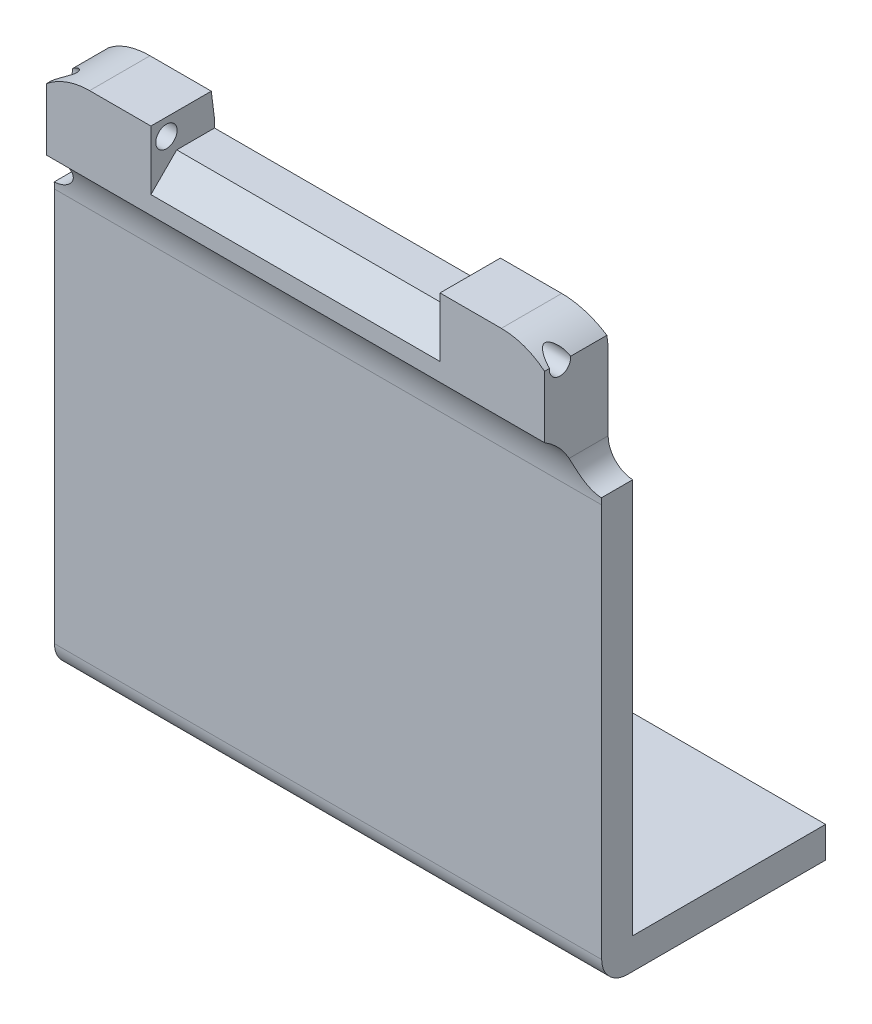
ISO-10303-21;
HEADER;
FILE_DESCRIPTION(('STEP AP214'),'2;1');
FILE_NAME('part.step','',(''),(''),'','','');
FILE_SCHEMA(('AUTOMOTIVE_DESIGN { 1 0 10303 214 1 1 1 1 }'));
ENDSEC;
DATA;
#1=APPLICATION_CONTEXT('core data for automotive mechanical design processes');
#2=APPLICATION_PROTOCOL_DEFINITION('international standard','automotive_design',2000,#1);
#3=PRODUCT_CONTEXT('',#1,'mechanical');
#4=PRODUCT('Part','Part','',(#3));
#5=PRODUCT_RELATED_PRODUCT_CATEGORY('part','',(#4));
#6=PRODUCT_DEFINITION_FORMATION('','',#4);
#7=PRODUCT_DEFINITION_CONTEXT('part definition',#1,'design');
#8=PRODUCT_DEFINITION('design','',#6,#7);
#9=PRODUCT_DEFINITION_SHAPE('','',#8);
#10=(LENGTH_UNIT() NAMED_UNIT(*) SI_UNIT(.MILLI.,.METRE.));
#11=(NAMED_UNIT(*) PLANE_ANGLE_UNIT() SI_UNIT($,.RADIAN.));
#12=(NAMED_UNIT(*) SI_UNIT($,.STERADIAN.) SOLID_ANGLE_UNIT());
#13=UNCERTAINTY_MEASURE_WITH_UNIT(LENGTH_MEASURE(1.E-05),#10,'distance_accuracy_value','');
#14=(GEOMETRIC_REPRESENTATION_CONTEXT(3) GLOBAL_UNCERTAINTY_ASSIGNED_CONTEXT((#13)) GLOBAL_UNIT_ASSIGNED_CONTEXT((#10,
#11,#12)) REPRESENTATION_CONTEXT('',''));
#15=CARTESIAN_POINT('',(0.,0.,0.));
#16=DIRECTION('',(0.,0.,1.));
#17=DIRECTION('',(1.,0.,0.));
#18=AXIS2_PLACEMENT_3D('',#15,#16,#17);
#19=CARTESIAN_POINT('',(0.,40.6,2.4));
#20=DIRECTION('',(0.,-1.,0.));
#21=DIRECTION('',(0.,0.,-1.));
#22=AXIS2_PLACEMENT_3D('',#19,#20,#21);
#23=PLANE('',#22);
#24=DIRECTION('',(1.,0.,0.));
#25=VECTOR('',#24,1.);
#26=CARTESIAN_POINT('',(-6.40000000000006,40.6,0.25));
#27=LINE('',#26,#25);
#28=CARTESIAN_POINT('',(5.24999999999999,40.6,0.25));
#29=VERTEX_POINT('',#28);
#30=CARTESIAN_POINT('',(9.99999999999994,40.6,0.25));
#31=VERTEX_POINT('',#30);
#32=EDGE_CURVE('E404',#29,#31,#27,.T.);
#33=ORIENTED_EDGE('',*,*,#32,.F.);
#34=DIRECTION('',(0.,0.,-1.));
#35=VECTOR('',#34,1.);
#36=CARTESIAN_POINT('',(5.24999999999999,40.6,2.4));
#37=LINE('',#36,#35);
#38=CARTESIAN_POINT('',(5.24999999999999,40.6,4.93));
#39=VERTEX_POINT('',#38);
#40=EDGE_CURVE('E329',#29,#39,#37,.F.);
#41=ORIENTED_EDGE('',*,*,#40,.T.);
#42=DIRECTION('',(-1.,0.,0.));
#43=VECTOR('',#42,1.);
#44=CARTESIAN_POINT('',(0.,40.6,4.93));
#45=LINE('',#44,#43);
#46=CARTESIAN_POINT('',(9.99999999999999,40.6,4.93));
#47=VERTEX_POINT('',#46);
#48=EDGE_CURVE('E238',#47,#39,#45,.T.);
#49=ORIENTED_EDGE('',*,*,#48,.F.);
#50=DIRECTION('',(0.,0.,1.));
#51=VECTOR('',#50,1.);
#52=CARTESIAN_POINT('',(9.99999999999999,40.6,-22.5503880232691));
#53=LINE('',#52,#51);
#54=EDGE_CURVE('E248',#31,#47,#53,.T.);
#55=ORIENTED_EDGE('',*,*,#54,.F.);
#56=EDGE_LOOP('',(#33,#41,#49,#55));
#57=FACE_BOUND('',#56,.T.);
#58=ADVANCED_FACE('F37',(#57),#23,.F.);
#59=CARTESIAN_POINT('',(0.,0.,0.));
#60=DIRECTION('',(0.,0.,-1.));
#61=DIRECTION('',(-1.,0.,0.));
#62=AXIS2_PLACEMENT_3D('',#59,#60,#61);
#63=PLANE('',#62);
#64=DIRECTION('',(0.,-1.,0.));
#65=VECTOR('',#64,1.);
#66=CARTESIAN_POINT('',(1.89999999999999,30.6,0.));
#67=LINE('',#66,#65);
#68=CARTESIAN_POINT('',(1.89999999999999,38.6,0.));
#69=VERTEX_POINT('',#68);
#70=CARTESIAN_POINT('',(1.89999999999999,32.5974984355438,0.));
#71=VERTEX_POINT('',#70);
#72=EDGE_CURVE('E386',#69,#71,#67,.T.);
#73=ORIENTED_EDGE('',*,*,#72,.F.);
#74=DIRECTION('',(1.,0.,0.));
#75=VECTOR('',#74,1.);
#76=CARTESIAN_POINT('',(-6.40000000000005,38.6,0.));
#77=LINE('',#76,#75);
#78=CARTESIAN_POINT('',(9.99999999999995,38.6,0.));
#79=VERTEX_POINT('',#78);
#80=EDGE_CURVE('E405',#69,#79,#77,.T.);
#81=ORIENTED_EDGE('',*,*,#80,.T.);
#82=DIRECTION('',(0.,-1.,0.));
#83=VECTOR('',#82,1.);
#84=CARTESIAN_POINT('',(9.99999999999999,40.6,0.));
#85=LINE('',#84,#83);
#86=CARTESIAN_POINT('',(9.99999999999999,38.,0.));
#87=VERTEX_POINT('',#86);
#88=EDGE_CURVE('E245',#79,#87,#85,.T.);
#89=ORIENTED_EDGE('',*,*,#88,.T.);
#90=DIRECTION('',(1.,0.,0.));
#91=VECTOR('',#90,1.);
#92=CARTESIAN_POINT('',(9.99999999999999,38.,0.));
#93=LINE('',#92,#91);
#94=CARTESIAN_POINT('',(32.4,38.,0.));
#95=VERTEX_POINT('',#94);
#96=EDGE_CURVE('E241',#87,#95,#93,.T.);
#97=ORIENTED_EDGE('',*,*,#96,.T.);
#98=DIRECTION('',(0.,1.,0.));
#99=VECTOR('',#98,1.);
#100=CARTESIAN_POINT('',(32.4,40.6,0.));
#101=LINE('',#100,#99);
#102=CARTESIAN_POINT('',(32.4,38.6,0.));
#103=VERTEX_POINT('',#102);
#104=EDGE_CURVE('E249',#95,#103,#101,.T.);
#105=ORIENTED_EDGE('',*,*,#104,.T.);
#106=DIRECTION('',(-1.,0.,0.));
#107=VECTOR('',#106,1.);
#108=CARTESIAN_POINT('',(48.8,38.6,0.));
#109=LINE('',#108,#107);
#110=CARTESIAN_POINT('',(40.5,38.6,0.));
#111=VERTEX_POINT('',#110);
#112=EDGE_CURVE('E223',#111,#103,#109,.T.);
#113=ORIENTED_EDGE('',*,*,#112,.F.);
#114=DIRECTION('',(0.,1.,0.));
#115=VECTOR('',#114,1.);
#116=CARTESIAN_POINT('',(40.5,30.6,0.));
#117=LINE('',#116,#115);
#118=CARTESIAN_POINT('',(40.5,32.5974984355438,0.));
#119=VERTEX_POINT('',#118);
#120=EDGE_CURVE('E374',#119,#111,#117,.T.);
#121=ORIENTED_EDGE('',*,*,#120,.F.);
#122=CARTESIAN_POINT('',(42.5,32.5974984355438,0.));
#123=DIRECTION('',(0.,0.,-1.));
#124=DIRECTION('',(-1.,0.,0.));
#125=AXIS2_PLACEMENT_3D('',#122,#123,#124);
#126=CIRCLE('',#125,2.);
#127=CARTESIAN_POINT('',(42.4,30.6,0.));
#128=VERTEX_POINT('',#127);
#129=EDGE_CURVE('E459',#119,#128,#126,.F.);
#130=ORIENTED_EDGE('',*,*,#129,.T.);
#131=DIRECTION('',(0.,1.,0.));
#132=VECTOR('',#131,1.);
#133=CARTESIAN_POINT('',(42.4,0.,0.));
#134=LINE('',#133,#132);
#135=CARTESIAN_POINT('',(42.4,0.,0.));
#136=VERTEX_POINT('',#135);
#137=EDGE_CURVE('E285',#136,#128,#134,.T.);
#138=ORIENTED_EDGE('',*,*,#137,.F.);
#139=DIRECTION('',(1.,0.,0.));
#140=VECTOR('',#139,1.);
#141=CARTESIAN_POINT('',(0.,0.,0.));
#142=LINE('',#141,#140);
#143=CARTESIAN_POINT('',(0.,0.,0.));
#144=VERTEX_POINT('',#143);
#145=EDGE_CURVE('E321',#144,#136,#142,.T.);
#146=ORIENTED_EDGE('',*,*,#145,.F.);
#147=DIRECTION('',(0.,-1.,0.));
#148=VECTOR('',#147,1.);
#149=CARTESIAN_POINT('',(0.,0.,0.));
#150=LINE('',#149,#148);
#151=CARTESIAN_POINT('',(0.,30.6,0.));
#152=VERTEX_POINT('',#151);
#153=EDGE_CURVE('E274',#152,#144,#150,.T.);
#154=ORIENTED_EDGE('',*,*,#153,.F.);
#155=CARTESIAN_POINT('',(-0.100000000000008,32.5974984355438,0.));
#156=DIRECTION('',(0.,0.,-1.));
#157=DIRECTION('',(-1.,0.,0.));
#158=AXIS2_PLACEMENT_3D('',#155,#156,#157);
#159=CIRCLE('',#158,2.);
#160=EDGE_CURVE('E533',#152,#71,#159,.F.);
#161=ORIENTED_EDGE('',*,*,#160,.T.);
#162=EDGE_LOOP('',(#73,#81,#89,#97,#105,#113,#121,#130,#138,#146,#154,#161));
#163=FACE_BOUND('',#162,.T.);
#164=ADVANCED_FACE('F353',(#163),#63,.T.);
#165=CARTESIAN_POINT('',(9.99999999999999,40.6,-22.5503880232691));
#166=DIRECTION('',(-1.,0.,0.));
#167=DIRECTION('',(0.,-1.,0.));
#168=AXIS2_PLACEMENT_3D('',#165,#166,#167);
#169=PLANE('',#168);
#170=CARTESIAN_POINT('',(9.99999999999999,39.3,3.73));
#171=DIRECTION('',(-1.,0.,0.));
#172=DIRECTION('',(0.,-1.,0.));
#173=AXIS2_PLACEMENT_3D('',#170,#171,#172);
#174=CIRCLE('',#173,0.8255);
#175=CARTESIAN_POINT('',(9.99999999999999,38.4745,3.73));
#176=VERTEX_POINT('',#175);
#177=EDGE_CURVE('E411',#176,#176,#174,.T.);
#178=ORIENTED_EDGE('',*,*,#177,.T.);
#179=EDGE_LOOP('',(#178));
#180=FACE_BOUND('',#179,.T.);
#181=DIRECTION('',(0.,0.992277876713668,0.124034734589208));
#182=VECTOR('',#181,1.);
#183=CARTESIAN_POINT('',(9.99999999999995,38.6,0.));
#184=LINE('',#183,#182);
#185=EDGE_CURVE('E407',#79,#31,#184,.T.);
#186=ORIENTED_EDGE('',*,*,#185,.T.);
#187=ORIENTED_EDGE('',*,*,#54,.T.);
#188=DIRECTION('',(0.,1.,0.));
#189=VECTOR('',#188,1.);
#190=CARTESIAN_POINT('',(9.99999999999994,0.,4.93));
#191=LINE('',#190,#189);
#192=CARTESIAN_POINT('',(9.99999999999999,36.,4.93));
#193=VERTEX_POINT('',#192);
#194=EDGE_CURVE('E235',#193,#47,#191,.T.);
#195=ORIENTED_EDGE('',*,*,#194,.F.);
#196=DIRECTION('',(0.,0.707106781186548,-0.707106781186547));
#197=VECTOR('',#196,1.);
#198=CARTESIAN_POINT('',(10.,52.0401940116346,-11.1101940116346));
#199=LINE('',#198,#197);
#200=CARTESIAN_POINT('',(9.99999999999999,38.,2.93));
#201=VERTEX_POINT('',#200);
#202=EDGE_CURVE('E309',#193,#201,#199,.T.);
#203=ORIENTED_EDGE('',*,*,#202,.T.);
#204=DIRECTION('',(0.,0.,1.));
#205=VECTOR('',#204,1.);
#206=CARTESIAN_POINT('',(9.99999999999999,38.,-22.5503880232691));
#207=LINE('',#206,#205);
#208=EDGE_CURVE('E247',#87,#201,#207,.T.);
#209=ORIENTED_EDGE('',*,*,#208,.F.);
#210=ORIENTED_EDGE('',*,*,#88,.F.);
#211=EDGE_LOOP('',(#186,#187,#195,#203,#209,#210));
#212=FACE_BOUND('',#211,.T.);
#213=ADVANCED_FACE('F472',(#180,#212),#169,.F.);
#214=CARTESIAN_POINT('',(5.24999999999999,35.35,2.4));
#215=DIRECTION('',(0.,0.,-1.));
#216=DIRECTION('',(-1.,0.,0.));
#217=AXIS2_PLACEMENT_3D('',#214,#215,#216);
#218=CYLINDRICAL_SURFACE('',#217,5.25);
#219=CARTESIAN_POINT('',(1.89999999999999,39.3922765862816,4.55032632630205));
#220=CARTESIAN_POINT('',(1.94479551163483,39.4294093338187,4.54612443450912));
#221=CARTESIAN_POINT('',(1.99006150544366,39.4656581903158,4.53951913065735));
#222=CARTESIAN_POINT('',(2.08121739171,39.5362418920273,4.52181697594956));
#223=CARTESIAN_POINT('',(2.12710736051293,39.5705765003574,4.51071957060289));
#224=CARTESIAN_POINT('',(2.21961170673907,39.637486388212,4.48422687890102));
#225=CARTESIAN_POINT('',(2.26622885031798,39.6700423027259,4.46879252466194));
#226=CARTESIAN_POINT('',(2.35938468034829,39.7329217674914,4.43379185839554));
#227=CARTESIAN_POINT('',(2.40592338462143,39.7632459196345,4.4142266659757));
#228=CARTESIAN_POINT('',(2.51209851476046,39.8301093308134,4.36454691538954));
#229=CARTESIAN_POINT('',(2.57158468366692,39.8658723623732,4.33302057089803));
#230=CARTESIAN_POINT('',(2.65897106812032,39.9162022496431,4.27984931278051));
#231=CARTESIAN_POINT('',(2.68775640372301,39.932407467515,4.26117341782208));
#232=CARTESIAN_POINT('',(2.74442417609733,39.9636355037812,4.22160398592261));
#233=CARTESIAN_POINT('',(2.77230707622054,39.9786589348147,4.20071161137698));
#234=CARTESIAN_POINT('',(2.82687120517793,40.0074568580747,4.15621873441124));
#235=CARTESIAN_POINT('',(2.85354391224557,40.0212230297639,4.13260224535661));
#236=CARTESIAN_POINT('',(2.90470674115937,40.0471179725423,4.08223263769853));
#237=CARTESIAN_POINT('',(2.92919720232575,40.059246998345,4.05548000824081));
#238=CARTESIAN_POINT('',(2.96929703750828,40.078770664092,4.00481437923992));
#239=CARTESIAN_POINT('',(2.98565108067116,40.0866117207626,3.98167307585694));
#240=CARTESIAN_POINT('',(3.01509214710321,40.1005737687792,3.93290721368998));
#241=CARTESIAN_POINT('',(3.02818669091601,40.1066987238168,3.90728856422625));
#242=CARTESIAN_POINT('',(3.04648768865567,40.115197286981,3.86144610222564));
#243=CARTESIAN_POINT('',(3.05288034528994,40.1181436147152,3.84180938222267));
#244=CARTESIAN_POINT('',(3.0626470243617,40.1226320225505,3.80164718718955));
#245=CARTESIAN_POINT('',(3.06602538474746,40.124176120692,3.78112303406255));
#246=CARTESIAN_POINT('',(3.06937232344381,40.1257059121243,3.73962465834349));
#247=CARTESIAN_POINT('',(3.0693234503886,40.1256836294514,3.71864867607631));
#248=CARTESIAN_POINT('',(3.06577945706789,40.1240636640948,3.67704837526184));
#249=CARTESIAN_POINT('',(3.06228146977534,40.122464670793,3.65642436379452));
#250=CARTESIAN_POINT('',(3.05132845655203,40.1174296056511,3.61236340953032));
#251=CARTESIAN_POINT('',(3.04325927517489,40.113707547655,3.58911524038118));
#252=CARTESIAN_POINT('',(3.02387525385716,40.1046801160291,3.54435393401908));
#253=CARTESIAN_POINT('',(3.01255395516674,40.0993715907981,3.52284435969737));
#254=CARTESIAN_POINT('',(2.97958248263248,40.0837312205632,3.46834939049551));
#255=CARTESIAN_POINT('',(2.95596924460032,40.0723631721602,3.43686905317666));
#256=CARTESIAN_POINT('',(2.90518614853682,40.0473566100936,3.37795438138637));
#257=CARTESIAN_POINT('',(2.87800507141614,40.033710895911,3.35053341592737));
#258=CARTESIAN_POINT('',(2.82149069462722,40.0046593635536,3.29897784779892));
#259=CARTESIAN_POINT('',(2.79215393769772,39.9892506949091,3.27484870969829));
#260=CARTESIAN_POINT('',(2.73215031022314,39.9569621402811,3.22937307372082));
#261=CARTESIAN_POINT('',(2.70148224421482,39.9400809176758,3.20802914874087));
#262=CARTESIAN_POINT('',(2.60808003981878,39.887384157354,3.14749639839147));
#263=CARTESIAN_POINT('',(2.54409238679567,39.8495887586783,3.11192912188918));
#264=CARTESIAN_POINT('',(2.43097327375769,39.7793213096503,3.05682710902474));
#265=CARTESIAN_POINT('',(2.3820674381295,39.7478333020484,3.03550146707469));
#266=CARTESIAN_POINT('',(2.28410011618964,39.6823670961339,2.99741468825444));
#267=CARTESIAN_POINT('',(2.23503858115977,39.648388025404,2.98065516030906));
#268=CARTESIAN_POINT('',(2.13789496788983,39.5785726005372,2.95201985786845));
#269=CARTESIAN_POINT('',(2.08980874970376,39.5427685936108,2.94007949112553));
#270=CARTESIAN_POINT('',(1.99431024607621,39.4690585778348,2.92110864141387));
#271=CARTESIAN_POINT('',(1.94689778118211,39.4311531423981,2.914076826107));
#272=CARTESIAN_POINT('',(1.89999999999999,39.3922765862816,2.90967367369795));
#273=B_SPLINE_CURVE_WITH_KNOTS('',3,(#219,#220,#221,#222,#223,#224,#225,#226,#227,#228,#229,
#230,#231,#232,#233,#234,#235,#236,#237,#238,#239,#240,#241,#242,#243,#244,#245,#246,#247,#248,
#249,#250,#251,#252,#253,#254,#255,#256,#257,#258,#259,#260,#261,#262,#263,#264,#265,#266,#267,
#268,#269,#270,#271,#272),.UNSPECIFIED.,.F.,.F.,(4,2,2,2,2,2,2,2,2,2,2,2,2,2,2,2,2,2,2,2,2,2,2,
2,2,2,4),(0.,0.174909031247369,0.3498396592937,0.526399596627009,0.702911741082781,
0.931049483230055,1.04482223399399,1.15853561077051,1.27295398005045,1.38735452711235,
1.47532730278542,1.5630951798677,1.62543759740949,1.68769015104688,1.75025971564995,
1.81288133419456,1.88713083733349,1.96152883276486,2.08372287068408,2.20631078991446,
2.32909979626436,2.45200144034905,2.69840832684892,2.88408119891577,3.06981941067075,
3.25297812378894,3.43608710241227),.UNSPECIFIED.);
#274=CARTESIAN_POINT('',(1.89999999999999,39.3922765862816,4.55032632630205));
#275=VERTEX_POINT('',#274);
#276=CARTESIAN_POINT('',(1.89999999999999,39.3922765862816,2.90967367369795));
#277=VERTEX_POINT('',#276);
#278=EDGE_CURVE('E52',#275,#277,#273,.T.);
#279=ORIENTED_EDGE('',*,*,#278,.F.);
#280=DIRECTION('',(0.,0.,-1.));
#281=VECTOR('',#280,1.);
#282=CARTESIAN_POINT('',(1.89999999999999,39.3922765862816,2.4));
#283=LINE('',#282,#281);
#284=CARTESIAN_POINT('',(1.89999999999999,39.3922765862816,4.93));
#285=VERTEX_POINT('',#284);
#286=EDGE_CURVE('E377',#285,#275,#283,.T.);
#287=ORIENTED_EDGE('',*,*,#286,.F.);
#288=CARTESIAN_POINT('',(5.24999999999999,35.35,4.93));
#289=DIRECTION('',(0.,0.,1.));
#290=DIRECTION('',(1.,0.,0.));
#291=AXIS2_PLACEMENT_3D('',#288,#289,#290);
#292=CIRCLE('',#291,5.25);
#293=EDGE_CURVE('E332',#39,#285,#292,.T.);
#294=ORIENTED_EDGE('',*,*,#293,.F.);
#295=ORIENTED_EDGE('',*,*,#40,.F.);
#296=CARTESIAN_POINT('',(5.24999999999999,35.35,-0.406250000000002));
#297=DIRECTION('',(0.,0.124034734589208,-0.992277876713668));
#298=DIRECTION('',(0.,-0.992277876713668,-0.124034734589208));
#299=AXIS2_PLACEMENT_3D('',#296,#297,#298);
#300=ELLIPSE('',#299,5.29085664732092,5.25);
#301=CARTESIAN_POINT('',(1.89999999999999,39.3922765862816,0.0990345732851897));
#302=VERTEX_POINT('',#301);
#303=EDGE_CURVE('E394',#29,#302,#300,.F.);
#304=ORIENTED_EDGE('',*,*,#303,.T.);
#305=EDGE_CURVE('E381',#277,#302,#283,.T.);
#306=ORIENTED_EDGE('',*,*,#305,.F.);
#307=EDGE_LOOP('',(#279,#287,#294,#295,#304,#306));
#308=FACE_BOUND('',#307,.T.);
#309=ADVANCED_FACE('F422',(#308),#218,.T.);
#310=CARTESIAN_POINT('',(1.89999999999999,30.6,4.93));
#311=DIRECTION('',(1.,0.,0.));
#312=DIRECTION('',(0.,0.,-1.));
#313=AXIS2_PLACEMENT_3D('',#310,#311,#312);
#314=PLANE('',#313);
#315=ORIENTED_EDGE('',*,*,#286,.T.);
#316=CARTESIAN_POINT('',(1.89999999999999,39.3,3.73));
#317=DIRECTION('',(1.,0.,0.));
#318=DIRECTION('',(0.,0.,-1.));
#319=AXIS2_PLACEMENT_3D('',#316,#317,#318);
#320=CIRCLE('',#319,0.8255);
#321=EDGE_CURVE('E420',#275,#277,#320,.T.);
#322=ORIENTED_EDGE('',*,*,#321,.T.);
#323=ORIENTED_EDGE('',*,*,#305,.T.);
#324=DIRECTION('',(0.,0.992277876713668,0.124034734589208));
#325=VECTOR('',#324,1.);
#326=CARTESIAN_POINT('',(1.89999999999999,31.3298461538462,-0.908769230769233));
#327=LINE('',#326,#325);
#328=EDGE_CURVE('E46',#69,#302,#327,.T.);
#329=ORIENTED_EDGE('',*,*,#328,.F.);
#330=ORIENTED_EDGE('',*,*,#72,.T.);
#331=DIRECTION('',(0.,0.,1.));
#332=VECTOR('',#331,1.);
#333=CARTESIAN_POINT('',(1.89999999999999,32.5974984355438,4.93));
#334=LINE('',#333,#332);
#335=CARTESIAN_POINT('',(1.89999999999999,32.5974984355438,3.02694522956467));
#336=VERTEX_POINT('',#335);
#337=EDGE_CURVE('E318',#71,#336,#334,.T.);
#338=ORIENTED_EDGE('',*,*,#337,.T.);
#339=CARTESIAN_POINT('',(1.89999999999999,30.1095545877942,7.65));
#340=DIRECTION('',(1.,0.,0.));
#341=DIRECTION('',(0.,0.,-1.));
#342=AXIS2_PLACEMENT_3D('',#339,#340,#341);
#343=CIRCLE('',#342,5.25);
#344=CARTESIAN_POINT('',(1.89999999999999,34.6,4.93));
#345=VERTEX_POINT('',#344);
#346=EDGE_CURVE('E315',#345,#336,#343,.F.);
#347=ORIENTED_EDGE('',*,*,#346,.F.);
#348=DIRECTION('',(0.,-1.,0.));
#349=VECTOR('',#348,1.);
#350=CARTESIAN_POINT('',(1.89999999999999,30.6,4.93));
#351=LINE('',#350,#349);
#352=EDGE_CURVE('E385',#285,#345,#351,.T.);
#353=ORIENTED_EDGE('',*,*,#352,.F.);
#354=EDGE_LOOP('',(#315,#322,#323,#329,#330,#338,#347,#353));
#355=FACE_BOUND('',#354,.T.);
#356=ADVANCED_FACE('F480',(#355),#314,.F.);
#357=CARTESIAN_POINT('',(0.,0.,2.4));
#358=DIRECTION('',(0.,0.,-1.));
#359=DIRECTION('',(-1.,0.,0.));
#360=AXIS2_PLACEMENT_3D('',#357,#358,#359);
#361=PLANE('',#360);
#362=DIRECTION('',(1.,0.,0.));
#363=VECTOR('',#362,1.);
#364=CARTESIAN_POINT('',(40.,-0.4,2.4));
#365=LINE('',#364,#363);
#366=CARTESIAN_POINT('',(0.,-0.4,2.4));
#367=VERTEX_POINT('',#366);
#368=CARTESIAN_POINT('',(42.4,-0.4,2.4));
#369=VERTEX_POINT('',#368);
#370=EDGE_CURVE('E297',#367,#369,#365,.T.);
#371=ORIENTED_EDGE('',*,*,#370,.T.);
#372=DIRECTION('',(0.,1.,0.));
#373=VECTOR('',#372,1.);
#374=CARTESIAN_POINT('',(42.4,0.,2.4));
#375=LINE('',#374,#373);
#376=CARTESIAN_POINT('',(42.4,30.1095545877942,2.4));
#377=VERTEX_POINT('',#376);
#378=EDGE_CURVE('E284',#369,#377,#375,.T.);
#379=ORIENTED_EDGE('',*,*,#378,.T.);
#380=DIRECTION('',(1.,0.,0.));
#381=VECTOR('',#380,1.);
#382=CARTESIAN_POINT('',(0.,30.1095545877942,2.4));
#383=LINE('',#382,#381);
#384=CARTESIAN_POINT('',(0.,30.1095545877942,2.4));
#385=VERTEX_POINT('',#384);
#386=EDGE_CURVE('E288',#377,#385,#383,.F.);
#387=ORIENTED_EDGE('',*,*,#386,.T.);
#388=DIRECTION('',(0.,-1.,0.));
#389=VECTOR('',#388,1.);
#390=CARTESIAN_POINT('',(0.,0.,2.4));
#391=LINE('',#390,#389);
#392=EDGE_CURVE('E280',#385,#367,#391,.T.);
#393=ORIENTED_EDGE('',*,*,#392,.T.);
#394=EDGE_LOOP('',(#371,#379,#387,#393));
#395=FACE_BOUND('',#394,.T.);
#396=ADVANCED_FACE('F491',(#395),#361,.F.);
#397=DIRECTION('',(0.,0.,-1.));
#398=VECTOR('',#397,1.);
#399=CARTESIAN_POINT('',(37.15,40.6,2.4));
#400=LINE('',#399,#398);
#401=CARTESIAN_POINT('',(37.15,40.6,4.93));
#402=VERTEX_POINT('',#401);
#403=CARTESIAN_POINT('',(37.15,40.6,0.25));
#404=VERTEX_POINT('',#403);
#405=EDGE_CURVE('E286',#402,#404,#400,.T.);
#406=ORIENTED_EDGE('',*,*,#405,.T.);
#407=DIRECTION('',(-1.,0.,0.));
#408=VECTOR('',#407,1.);
#409=CARTESIAN_POINT('',(48.8000000000001,40.6,0.25));
#410=LINE('',#409,#408);
#411=CARTESIAN_POINT('',(32.4000000000001,40.6,0.25));
#412=VERTEX_POINT('',#411);
#413=EDGE_CURVE('E222',#404,#412,#410,.T.);
#414=ORIENTED_EDGE('',*,*,#413,.T.);
#415=DIRECTION('',(0.,0.,1.));
#416=VECTOR('',#415,1.);
#417=CARTESIAN_POINT('',(32.4,40.6,-22.5503880232691));
#418=LINE('',#417,#416);
#419=CARTESIAN_POINT('',(32.4,40.6,4.93));
#420=VERTEX_POINT('',#419);
#421=EDGE_CURVE('E252',#412,#420,#418,.T.);
#422=ORIENTED_EDGE('',*,*,#421,.T.);
#423=DIRECTION('',(-1.,0.,0.));
#424=VECTOR('',#423,1.);
#425=CARTESIAN_POINT('',(0.,40.6,4.93));
#426=LINE('',#425,#424);
#427=EDGE_CURVE('E230',#402,#420,#426,.T.);
#428=ORIENTED_EDGE('',*,*,#427,.F.);
#429=EDGE_LOOP('',(#406,#414,#422,#428));
#430=FACE_BOUND('',#429,.T.);
#431=ADVANCED_FACE('F341',(#430),#23,.F.);
#432=CARTESIAN_POINT('',(0.,0.,2.4));
#433=DIRECTION('',(1.,0.,0.));
#434=DIRECTION('',(0.,1.,0.));
#435=AXIS2_PLACEMENT_3D('',#432,#433,#434);
#436=PLANE('',#435);
#437=CARTESIAN_POINT('',(0.,30.1095545877942,7.65));
#438=DIRECTION('',(1.,0.,0.));
#439=DIRECTION('',(0.,1.,0.));
#440=AXIS2_PLACEMENT_3D('',#437,#438,#439);
#441=CIRCLE('',#440,5.25);
#442=CARTESIAN_POINT('',(0.,30.6,2.4229584564836));
#443=VERTEX_POINT('',#442);
#444=EDGE_CURVE('E292',#385,#443,#441,.T.);
#445=ORIENTED_EDGE('',*,*,#444,.T.);
#446=DIRECTION('',(0.,0.,-1.));
#447=VECTOR('',#446,1.);
#448=CARTESIAN_POINT('',(0.,30.6,4.93));
#449=LINE('',#448,#447);
#450=EDGE_CURVE('E382',#443,#152,#449,.T.);
#451=ORIENTED_EDGE('',*,*,#450,.T.);
#452=ORIENTED_EDGE('',*,*,#153,.T.);
#453=DIRECTION('',(0.,0.,1.));
#454=VECTOR('',#453,1.);
#455=CARTESIAN_POINT('',(0.,0.,-14.95));
#456=LINE('',#455,#454);
#457=CARTESIAN_POINT('',(0.,0.,-14.95));
#458=VERTEX_POINT('',#457);
#459=EDGE_CURVE('E271',#458,#144,#456,.T.);
#460=ORIENTED_EDGE('',*,*,#459,.F.);
#461=DIRECTION('',(0.,-1.,0.));
#462=VECTOR('',#461,1.);
#463=CARTESIAN_POINT('',(0.,0.,-14.95));
#464=LINE('',#463,#462);
#465=CARTESIAN_POINT('',(0.,-2.4,-14.95));
#466=VERTEX_POINT('',#465);
#467=EDGE_CURVE('E259',#458,#466,#464,.T.);
#468=ORIENTED_EDGE('',*,*,#467,.T.);
#469=DIRECTION('',(0.,0.,1.));
#470=VECTOR('',#469,1.);
#471=CARTESIAN_POINT('',(0.,-2.4,-14.95));
#472=LINE('',#471,#470);
#473=CARTESIAN_POINT('',(0.,-2.4,0.399999999999999));
#474=VERTEX_POINT('',#473);
#475=EDGE_CURVE('E267',#466,#474,#472,.T.);
#476=ORIENTED_EDGE('',*,*,#475,.T.);
#477=CARTESIAN_POINT('',(0.,-0.4,0.4));
#478=DIRECTION('',(1.,0.,0.));
#479=DIRECTION('',(0.,1.,0.));
#480=AXIS2_PLACEMENT_3D('',#477,#478,#479);
#481=CIRCLE('',#480,2.);
#482=EDGE_CURVE('E302',#474,#367,#481,.F.);
#483=ORIENTED_EDGE('',*,*,#482,.T.);
#484=ORIENTED_EDGE('',*,*,#392,.F.);
#485=EDGE_LOOP('',(#445,#451,#452,#460,#468,#476,#483,#484));
#486=FACE_BOUND('',#485,.T.);
#487=ADVANCED_FACE('F490',(#486),#436,.F.);
#488=CARTESIAN_POINT('',(42.4,0.,2.4));
#489=DIRECTION('',(-1.,0.,0.));
#490=DIRECTION('',(0.,-1.,0.));
#491=AXIS2_PLACEMENT_3D('',#488,#489,#490);
#492=PLANE('',#491);
#493=ORIENTED_EDGE('',*,*,#137,.T.);
#494=DIRECTION('',(0.,0.,-1.));
#495=VECTOR('',#494,1.);
#496=CARTESIAN_POINT('',(42.4,30.6,4.93));
#497=LINE('',#496,#495);
#498=CARTESIAN_POINT('',(42.4,30.6,2.4229584564836));
#499=VERTEX_POINT('',#498);
#500=EDGE_CURVE('E217',#499,#128,#497,.T.);
#501=ORIENTED_EDGE('',*,*,#500,.F.);
#502=CARTESIAN_POINT('',(42.4,30.1095545877942,7.65));
#503=DIRECTION('',(-1.,0.,0.));
#504=DIRECTION('',(0.,-1.,0.));
#505=AXIS2_PLACEMENT_3D('',#502,#503,#504);
#506=CIRCLE('',#505,5.25);
#507=EDGE_CURVE('E290',#499,#377,#506,.T.);
#508=ORIENTED_EDGE('',*,*,#507,.T.);
#509=ORIENTED_EDGE('',*,*,#378,.F.);
#510=CARTESIAN_POINT('',(42.4,-0.4,0.4));
#511=DIRECTION('',(-1.,0.,0.));
#512=DIRECTION('',(0.,-1.,0.));
#513=AXIS2_PLACEMENT_3D('',#510,#511,#512);
#514=CIRCLE('',#513,2.);
#515=CARTESIAN_POINT('',(42.4,-2.4,0.4));
#516=VERTEX_POINT('',#515);
#517=EDGE_CURVE('E388',#516,#369,#514,.T.);
#518=ORIENTED_EDGE('',*,*,#517,.F.);
#519=DIRECTION('',(0.,0.,1.));
#520=VECTOR('',#519,1.);
#521=CARTESIAN_POINT('',(42.4,-2.4,0.4));
#522=LINE('',#521,#520);
#523=CARTESIAN_POINT('',(42.4,-2.4,-14.95));
#524=VERTEX_POINT('',#523);
#525=EDGE_CURVE('E397',#524,#516,#522,.T.);
#526=ORIENTED_EDGE('',*,*,#525,.F.);
#527=DIRECTION('',(0.,-1.,0.));
#528=VECTOR('',#527,1.);
#529=CARTESIAN_POINT('',(42.4,-2.4,-14.95));
#530=LINE('',#529,#528);
#531=CARTESIAN_POINT('',(42.4,0.,-14.95));
#532=VERTEX_POINT('',#531);
#533=EDGE_CURVE('E393',#532,#524,#530,.T.);
#534=ORIENTED_EDGE('',*,*,#533,.F.);
#535=DIRECTION('',(0.,0.,-1.));
#536=VECTOR('',#535,1.);
#537=CARTESIAN_POINT('',(42.4,0.,-14.95));
#538=LINE('',#537,#536);
#539=EDGE_CURVE('E390',#136,#532,#538,.T.);
#540=ORIENTED_EDGE('',*,*,#539,.F.);
#541=EDGE_LOOP('',(#493,#501,#508,#509,#518,#526,#534,#540));
#542=FACE_BOUND('',#541,.T.);
#543=ADVANCED_FACE('F496',(#542),#492,.F.);
#544=CARTESIAN_POINT('',(0.,0.,-14.95));
#545=DIRECTION('',(0.,1.,0.));
#546=DIRECTION('',(0.,0.,1.));
#547=AXIS2_PLACEMENT_3D('',#544,#545,#546);
#548=PLANE('',#547);
#549=ORIENTED_EDGE('',*,*,#459,.T.);
#550=ORIENTED_EDGE('',*,*,#145,.T.);
#551=ORIENTED_EDGE('',*,*,#539,.T.);
#552=DIRECTION('',(-1.,0.,0.));
#553=VECTOR('',#552,1.);
#554=CARTESIAN_POINT('',(0.,0.,-14.95));
#555=LINE('',#554,#553);
#556=EDGE_CURVE('E264',#532,#458,#555,.T.);
#557=ORIENTED_EDGE('',*,*,#556,.T.);
#558=EDGE_LOOP('',(#549,#550,#551,#557));
#559=FACE_BOUND('',#558,.T.);
#560=ADVANCED_FACE('F508',(#559),#548,.T.);
#561=CARTESIAN_POINT('',(0.,-2.4,-14.95));
#562=DIRECTION('',(0.,-1.,0.));
#563=DIRECTION('',(0.,0.,-1.));
#564=AXIS2_PLACEMENT_3D('',#561,#562,#563);
#565=PLANE('',#564);
#566=DIRECTION('',(1.,0.,0.));
#567=VECTOR('',#566,1.);
#568=CARTESIAN_POINT('',(0.,-2.4,-14.95));
#569=LINE('',#568,#567);
#570=EDGE_CURVE('E262',#466,#524,#569,.T.);
#571=ORIENTED_EDGE('',*,*,#570,.T.);
#572=ORIENTED_EDGE('',*,*,#525,.T.);
#573=DIRECTION('',(1.,0.,0.));
#574=VECTOR('',#573,1.);
#575=CARTESIAN_POINT('',(0.,-2.4,0.4));
#576=LINE('',#575,#574);
#577=EDGE_CURVE('E300',#516,#474,#576,.F.);
#578=ORIENTED_EDGE('',*,*,#577,.T.);
#579=ORIENTED_EDGE('',*,*,#475,.F.);
#580=EDGE_LOOP('',(#571,#572,#578,#579));
#581=FACE_BOUND('',#580,.T.);
#582=ADVANCED_FACE('F504',(#581),#565,.T.);
#583=CARTESIAN_POINT('',(0.,0.,-14.95));
#584=DIRECTION('',(0.,0.,1.));
#585=DIRECTION('',(1.,0.,0.));
#586=AXIS2_PLACEMENT_3D('',#583,#584,#585);
#587=PLANE('',#586);
#588=ORIENTED_EDGE('',*,*,#467,.F.);
#589=ORIENTED_EDGE('',*,*,#556,.F.);
#590=ORIENTED_EDGE('',*,*,#533,.T.);
#591=ORIENTED_EDGE('',*,*,#570,.F.);
#592=EDGE_LOOP('',(#588,#589,#590,#591));
#593=FACE_BOUND('',#592,.T.);
#594=ADVANCED_FACE('F507',(#593),#587,.F.);
#595=CARTESIAN_POINT('',(9.99999999999999,38.,-22.5503880232691));
#596=DIRECTION('',(0.,-1.,0.));
#597=DIRECTION('',(0.,0.,-1.));
#598=AXIS2_PLACEMENT_3D('',#595,#596,#597);
#599=PLANE('',#598);
#600=ORIENTED_EDGE('',*,*,#208,.T.);
#601=DIRECTION('',(1.,0.,0.));
#602=VECTOR('',#601,1.);
#603=CARTESIAN_POINT('',(32.4,38.,2.93));
#604=LINE('',#603,#602);
#605=CARTESIAN_POINT('',(32.4,38.,2.93));
#606=VERTEX_POINT('',#605);
#607=EDGE_CURVE('E307',#201,#606,#604,.T.);
#608=ORIENTED_EDGE('',*,*,#607,.T.);
#609=DIRECTION('',(0.,0.,1.));
#610=VECTOR('',#609,1.);
#611=CARTESIAN_POINT('',(32.4,38.,-22.5503880232691));
#612=LINE('',#611,#610);
#613=EDGE_CURVE('E244',#95,#606,#612,.T.);
#614=ORIENTED_EDGE('',*,*,#613,.F.);
#615=ORIENTED_EDGE('',*,*,#96,.F.);
#616=EDGE_LOOP('',(#600,#608,#614,#615));
#617=FACE_BOUND('',#616,.T.);
#618=ADVANCED_FACE('F360',(#617),#599,.F.);
#619=CARTESIAN_POINT('',(32.4,40.6,-22.5503880232691));
#620=DIRECTION('',(1.,0.,0.));
#621=DIRECTION('',(0.,0.,-1.));
#622=AXIS2_PLACEMENT_3D('',#619,#620,#621);
#623=PLANE('',#622);
#624=CARTESIAN_POINT('',(32.4,39.3,3.73));
#625=DIRECTION('',(1.,0.,0.));
#626=DIRECTION('',(0.,0.,-1.));
#627=AXIS2_PLACEMENT_3D('',#624,#625,#626);
#628=CIRCLE('',#627,0.8255);
#629=CARTESIAN_POINT('',(32.4,39.3,2.9045));
#630=VERTEX_POINT('',#629);
#631=EDGE_CURVE('E208',#630,#630,#628,.T.);
#632=ORIENTED_EDGE('',*,*,#631,.T.);
#633=EDGE_LOOP('',(#632));
#634=FACE_BOUND('',#633,.T.);
#635=ORIENTED_EDGE('',*,*,#421,.F.);
#636=DIRECTION('',(0.,0.992277876713668,0.124034734589208));
#637=VECTOR('',#636,1.);
#638=CARTESIAN_POINT('',(32.4,38.6,0.));
#639=LINE('',#638,#637);
#640=EDGE_CURVE('E215',#103,#412,#639,.T.);
#641=ORIENTED_EDGE('',*,*,#640,.F.);
#642=ORIENTED_EDGE('',*,*,#104,.F.);
#643=ORIENTED_EDGE('',*,*,#613,.T.);
#644=DIRECTION('',(0.,-0.707106781186548,0.707106781186547));
#645=VECTOR('',#644,1.);
#646=CARTESIAN_POINT('',(32.4,52.0401940116346,-11.1101940116346));
#647=LINE('',#646,#645);
#648=CARTESIAN_POINT('',(32.4,36.,4.93));
#649=VERTEX_POINT('',#648);
#650=EDGE_CURVE('E311',#606,#649,#647,.T.);
#651=ORIENTED_EDGE('',*,*,#650,.T.);
#652=DIRECTION('',(0.,-1.,0.));
#653=VECTOR('',#652,1.);
#654=CARTESIAN_POINT('',(32.4,0.,4.93));
#655=LINE('',#654,#653);
#656=EDGE_CURVE('E233',#420,#649,#655,.T.);
#657=ORIENTED_EDGE('',*,*,#656,.F.);
#658=EDGE_LOOP('',(#635,#641,#642,#643,#651,#657));
#659=FACE_BOUND('',#658,.T.);
#660=ADVANCED_FACE('F348',(#634,#659),#623,.F.);
#661=CARTESIAN_POINT('',(0.,0.,4.93));
#662=DIRECTION('',(0.,0.,1.));
#663=DIRECTION('',(1.,0.,0.));
#664=AXIS2_PLACEMENT_3D('',#661,#662,#663);
#665=PLANE('',#664);
#666=ORIENTED_EDGE('',*,*,#352,.T.);
#667=DIRECTION('',(1.,0.,0.));
#668=VECTOR('',#667,1.);
#669=CARTESIAN_POINT('',(0.,34.6,4.93));
#670=LINE('',#669,#668);
#671=CARTESIAN_POINT('',(40.5,34.6,4.93));
#672=VERTEX_POINT('',#671);
#673=EDGE_CURVE('E225',#345,#672,#670,.T.);
#674=ORIENTED_EDGE('',*,*,#673,.T.);
#675=DIRECTION('',(0.,1.,0.));
#676=VECTOR('',#675,1.);
#677=CARTESIAN_POINT('',(40.5,30.6,4.93));
#678=LINE('',#677,#676);
#679=CARTESIAN_POINT('',(40.5,39.3922765862815,4.93));
#680=VERTEX_POINT('',#679);
#681=EDGE_CURVE('E371',#672,#680,#678,.T.);
#682=ORIENTED_EDGE('',*,*,#681,.T.);
#683=CARTESIAN_POINT('',(37.15,35.35,4.93));
#684=DIRECTION('',(0.,0.,1.));
#685=DIRECTION('',(1.,0.,0.));
#686=AXIS2_PLACEMENT_3D('',#683,#684,#685);
#687=CIRCLE('',#686,5.25);
#688=EDGE_CURVE('E331',#680,#402,#687,.T.);
#689=ORIENTED_EDGE('',*,*,#688,.T.);
#690=ORIENTED_EDGE('',*,*,#427,.T.);
#691=ORIENTED_EDGE('',*,*,#656,.T.);
#692=DIRECTION('',(-1.,0.,0.));
#693=VECTOR('',#692,1.);
#694=CARTESIAN_POINT('',(9.99999999999999,36.,4.93));
#695=LINE('',#694,#693);
#696=EDGE_CURVE('E304',#649,#193,#695,.T.);
#697=ORIENTED_EDGE('',*,*,#696,.T.);
#698=ORIENTED_EDGE('',*,*,#194,.T.);
#699=ORIENTED_EDGE('',*,*,#48,.T.);
#700=ORIENTED_EDGE('',*,*,#293,.T.);
#701=EDGE_LOOP('',(#666,#674,#682,#689,#690,#691,#697,#698,#699,#700));
#702=FACE_BOUND('',#701,.T.);
#703=ADVANCED_FACE('F367',(#702),#665,.T.);
#704=CARTESIAN_POINT('',(37.15,35.35,2.4));
#705=DIRECTION('',(0.,0.,-1.));
#706=DIRECTION('',(-1.,0.,0.));
#707=AXIS2_PLACEMENT_3D('',#704,#705,#706);
#708=CYLINDRICAL_SURFACE('',#707,5.25);
#709=CARTESIAN_POINT('',(40.5,39.3922765862815,2.90967367369795));
#710=CARTESIAN_POINT('',(40.4552044883652,39.4294093338187,2.91387556549087));
#711=CARTESIAN_POINT('',(40.4099384945563,39.4656581903158,2.92048086934264));
#712=CARTESIAN_POINT('',(40.31878260829,39.5362418920273,2.93818302405043));
#713=CARTESIAN_POINT('',(40.2728926394871,39.5705765003574,2.9492804293971));
#714=CARTESIAN_POINT('',(40.1803882932609,39.637486388212,2.97577312109897));
#715=CARTESIAN_POINT('',(40.133771149682,39.6700423027259,2.99120747533804));
#716=CARTESIAN_POINT('',(40.0406153196517,39.7329217674914,3.02620814160444));
#717=CARTESIAN_POINT('',(39.9940766153786,39.7632459196345,3.04577333402428));
#718=CARTESIAN_POINT('',(39.8879014852395,39.8301093308134,3.09545308461045));
#719=CARTESIAN_POINT('',(39.828415316333,39.8658723623732,3.12697942910196));
#720=CARTESIAN_POINT('',(39.7410289318796,39.9162022496432,3.18015068721949));
#721=CARTESIAN_POINT('',(39.7122435962769,39.9324074675151,3.19882658217793));
#722=CARTESIAN_POINT('',(39.6555758239026,39.9636355037813,3.2383960140774));
#723=CARTESIAN_POINT('',(39.6276929237794,39.9786589348148,3.25928838862303));
#724=CARTESIAN_POINT('',(39.573128794822,40.0074568580747,3.30378126558877));
#725=CARTESIAN_POINT('',(39.5464560877544,40.0212230297639,3.3273977546434));
#726=CARTESIAN_POINT('',(39.4952932588406,40.0471179725424,3.37776736230147));
#727=CARTESIAN_POINT('',(39.4708027976742,40.059246998345,3.40451999175918));
#728=CARTESIAN_POINT('',(39.4307029624917,40.078770664092,3.45518562076006));
#729=CARTESIAN_POINT('',(39.4143489193288,40.0866117207626,3.47832692414304));
#730=CARTESIAN_POINT('',(39.3849078528967,40.1005737687792,3.52709278631001));
#731=CARTESIAN_POINT('',(39.3718133090839,40.1066987238168,3.55271143577374));
#732=CARTESIAN_POINT('',(39.3535123113443,40.115197286981,3.59855389777436));
#733=CARTESIAN_POINT('',(39.34711965471,40.1181436147152,3.61819061777733));
#734=CARTESIAN_POINT('',(39.3373529756382,40.1226320225505,3.65835281281045));
#735=CARTESIAN_POINT('',(39.3339746152525,40.1241761206921,3.67887696593744));
#736=CARTESIAN_POINT('',(39.3306276765561,40.1257059121244,3.7203753416565));
#737=CARTESIAN_POINT('',(39.3306765496113,40.1256836294514,3.74135132392368));
#738=CARTESIAN_POINT('',(39.3342205429321,40.1240636640949,3.78295162473815));
#739=CARTESIAN_POINT('',(39.3377185302246,40.122464670793,3.80357563620547));
#740=CARTESIAN_POINT('',(39.3486715434479,40.1174296056511,3.84763659046966));
#741=CARTESIAN_POINT('',(39.356740724825,40.113707547655,3.8708847596188));
#742=CARTESIAN_POINT('',(39.3761247461428,40.1046801160292,3.9156460659809));
#743=CARTESIAN_POINT('',(39.3874460448332,40.0993715907981,3.93715564030261));
#744=CARTESIAN_POINT('',(39.4204175173674,40.0837312205632,3.99165060950447));
#745=CARTESIAN_POINT('',(39.4440307553996,40.0723631721602,4.02313094682332));
#746=CARTESIAN_POINT('',(39.4948138514631,40.0473566100937,4.08204561861361));
#747=CARTESIAN_POINT('',(39.5219949285838,40.0337108959111,4.1094665840726));
#748=CARTESIAN_POINT('',(39.5785093053727,40.0046593635537,4.16102215220105));
#749=CARTESIAN_POINT('',(39.6078460623022,39.9892506949091,4.18515129030168));
#750=CARTESIAN_POINT('',(39.6678496897768,39.9569621402812,4.23062692627915));
#751=CARTESIAN_POINT('',(39.6985177557851,39.9400809176758,4.2519708512591));
#752=CARTESIAN_POINT('',(39.7919199601811,39.887384157354,4.3125036016085));
#753=CARTESIAN_POINT('',(39.8559076132042,39.8495887586784,4.34807087811079));
#754=CARTESIAN_POINT('',(39.9690267262422,39.7793213096504,4.40317289097523));
#755=CARTESIAN_POINT('',(40.0179325618704,39.7478333020484,4.42449853292529));
#756=CARTESIAN_POINT('',(40.1158998838103,39.682367096134,4.46258531174555));
#757=CARTESIAN_POINT('',(40.1649614188402,39.648388025404,4.47934483969093));
#758=CARTESIAN_POINT('',(40.2621050321101,39.5785726005373,4.50798014213155));
#759=CARTESIAN_POINT('',(40.3101912502962,39.5427685936108,4.51992050887447));
#760=CARTESIAN_POINT('',(40.4056897539238,39.4690585778348,4.53889135858614));
#761=CARTESIAN_POINT('',(40.4531022188179,39.4311531423981,4.545923173893));
#762=CARTESIAN_POINT('',(40.5,39.3922765862816,4.55032632630205));
#763=B_SPLINE_CURVE_WITH_KNOTS('',3,(#709,#710,#711,#712,#713,#714,#715,#716,#717,#718,#719,
#720,#721,#722,#723,#724,#725,#726,#727,#728,#729,#730,#731,#732,#733,#734,#735,#736,#737,#738,
#739,#740,#741,#742,#743,#744,#745,#746,#747,#748,#749,#750,#751,#752,#753,#754,#755,#756,#757,
#758,#759,#760,#761,#762),.UNSPECIFIED.,.F.,.F.,(4,2,2,2,2,2,2,2,2,2,2,2,2,2,2,2,2,2,2,2,2,2,2,
2,2,2,4),(0.,0.174909031247362,0.349839659293704,0.526399596627014,0.702911741082793,
0.931049483230101,1.04482223399406,1.15853561077059,1.27295398005051,1.38735452711239,
1.47532730278547,1.56309517986777,1.62543759740955,1.68769015104694,1.75025971565,
1.81288133419461,1.88713083733354,1.9615288327649,2.0837228706841,2.20631078991448,
2.32909979626438,2.45200144034905,2.69840832684891,2.88408119891579,3.0698194106708,
3.25297812378903,3.4360871024124),.UNSPECIFIED.);
#764=CARTESIAN_POINT('',(40.5,39.3922765862815,2.90967367369795));
#765=VERTEX_POINT('',#764);
#766=CARTESIAN_POINT('',(40.5,39.3922765862815,4.55032632630205));
#767=VERTEX_POINT('',#766);
#768=EDGE_CURVE('E59',#765,#767,#763,.T.);
#769=ORIENTED_EDGE('',*,*,#768,.F.);
#770=DIRECTION('',(0.,0.,-1.));
#771=VECTOR('',#770,1.);
#772=CARTESIAN_POINT('',(40.5,39.3922765862815,2.4));
#773=LINE('',#772,#771);
#774=CARTESIAN_POINT('',(40.5,39.3922765862815,0.0990345732851892));
#775=VERTEX_POINT('',#774);
#776=EDGE_CURVE('E204',#775,#765,#773,.F.);
#777=ORIENTED_EDGE('',*,*,#776,.F.);
#778=CARTESIAN_POINT('',(37.15,35.35,-0.406250000000003));
#779=DIRECTION('',(0.,-0.124034734589208,0.992277876713668));
#780=DIRECTION('',(0.,-0.992277876713668,-0.124034734589208));
#781=AXIS2_PLACEMENT_3D('',#778,#779,#780);
#782=ELLIPSE('',#781,5.29085664732092,5.25);
#783=EDGE_CURVE('E295',#404,#775,#782,.F.);
#784=ORIENTED_EDGE('',*,*,#783,.F.);
#785=ORIENTED_EDGE('',*,*,#405,.F.);
#786=ORIENTED_EDGE('',*,*,#688,.F.);
#787=EDGE_CURVE('E207',#767,#680,#773,.F.);
#788=ORIENTED_EDGE('',*,*,#787,.F.);
#789=EDGE_LOOP('',(#769,#777,#784,#785,#786,#788));
#790=FACE_BOUND('',#789,.T.);
#791=ADVANCED_FACE('F202',(#790),#708,.T.);
#792=CARTESIAN_POINT('',(0.,30.1095545877942,7.65));
#793=DIRECTION('',(1.,0.,0.));
#794=DIRECTION('',(0.,0.,-1.));
#795=AXIS2_PLACEMENT_3D('',#792,#793,#794);
#796=CYLINDRICAL_SURFACE('',#795,5.25);
#797=ORIENTED_EDGE('',*,*,#346,.T.);
#798=CARTESIAN_POINT('',(1.89999999999999,32.5974984355438,3.02694522956467));
#799=CARTESIAN_POINT('',(1.90000456252882,32.5458771793715,2.99915591252393));
#800=CARTESIAN_POINT('',(1.89800095414831,32.4937716739553,2.97223868705701));
#801=CARTESIAN_POINT('',(1.88978933708427,32.3889295152414,2.92026911218569));
#802=CARTESIAN_POINT('',(1.88357885432299,32.3361925084935,2.89521786980076));
#803=CARTESIAN_POINT('',(1.86674753019732,32.2303765935453,2.84708406997312));
#804=CARTESIAN_POINT('',(1.85611755817507,32.1772972027995,2.82400570820377));
#805=CARTESIAN_POINT('',(1.83033103583482,32.0713818971149,2.77998654523141));
#806=CARTESIAN_POINT('',(1.8151754076348,32.0185459348014,2.75904530974676));
#807=CARTESIAN_POINT('',(1.7626297227806,31.8606811995907,2.69937663670455));
#808=CARTESIAN_POINT('',(1.71820978054663,31.7566177530697,2.66394929313411));
#809=CARTESIAN_POINT('',(1.61106500399345,31.5557693605618,2.60202701338736));
#810=CARTESIAN_POINT('',(1.54837145018062,31.4589723291797,2.57551697835781));
#811=CARTESIAN_POINT('',(1.41089636976742,31.2826420458897,2.53198557601499));
#812=CARTESIAN_POINT('',(1.33720019538107,31.2023879035635,2.51444920598839));
#813=CARTESIAN_POINT('',(1.1770524261045,31.0544407099219,2.48517703794382));
#814=CARTESIAN_POINT('',(1.09059297130445,30.9867554572163,2.47344483377044));
#815=CARTESIAN_POINT('',(0.908341209208005,30.8668809961791,2.45455821894061));
#816=CARTESIAN_POINT('',(0.812649122079406,30.814545843222,2.4473598934907));
#817=CARTESIAN_POINT('',(0.613913823009528,30.726098416804,2.43613661421223));
#818=CARTESIAN_POINT('',(0.510875778063252,30.6899748683843,2.43210945340458));
#819=CARTESIAN_POINT('',(0.339281363944237,30.6451291150607,2.42736070618971));
#820=CARTESIAN_POINT('',(0.272053114487759,30.6312140490189,2.4259675291247));
#821=CARTESIAN_POINT('',(0.13661783017955,30.6103640887988,2.42393403466758));
#822=CARTESIAN_POINT('',(0.0684124668800624,30.6034184501754,2.42329255815629));
#823=CARTESIAN_POINT('',(0.,30.6,2.4229584564836));
#824=B_SPLINE_CURVE_WITH_KNOTS('',3,(#798,#799,#800,#801,#802,#803,#804,#805,#806,#807,#808,
#809,#810,#811,#812,#813,#814,#815,#816,#817,#818,#819,#820,#821,#822,#823),.UNSPECIFIED.,.F.,
.F.,(4,2,2,2,2,2,2,2,2,2,2,2,4),(0.,0.1758534710781,0.351810452099297,0.528132780779272,
0.704419207665107,1.05804781838836,1.41107461253357,1.74055162469553,2.070232389099,
2.39666869410655,2.72287761375842,2.9285422469409,3.13388932703893),.UNSPECIFIED.);
#825=EDGE_CURVE('E448',#336,#443,#824,.T.);
#826=ORIENTED_EDGE('',*,*,#825,.T.);
#827=ORIENTED_EDGE('',*,*,#444,.F.);
#828=ORIENTED_EDGE('',*,*,#386,.F.);
#829=ORIENTED_EDGE('',*,*,#507,.F.);
#830=CARTESIAN_POINT('',(42.4,30.6,2.4229584564836));
#831=CARTESIAN_POINT('',(42.3443541301761,30.6027860847402,2.42322491366704));
#832=CARTESIAN_POINT('',(42.2888520335474,30.6078969585121,2.42370112548743));
#833=CARTESIAN_POINT('',(42.1784738444434,30.6227262823947,2.42513437950681));
#834=CARTESIAN_POINT('',(42.1235977454227,30.6324446842837,2.42609141667357));
#835=CARTESIAN_POINT('',(41.9605344306629,30.6684218532635,2.42977304925797));
#836=CARTESIAN_POINT('',(41.8537878895692,30.7015089292516,2.43330848448317));
#837=CARTESIAN_POINT('',(41.6473739447885,30.7849189209029,2.4434528943656));
#838=CARTESIAN_POINT('',(41.5477118516945,30.8352546052106,2.45006414726201));
#839=CARTESIAN_POINT('',(41.3584134088032,30.9515626073055,2.46762919568846));
#840=CARTESIAN_POINT('',(41.2687733994277,31.0175291898202,2.47858139943066));
#841=CARTESIAN_POINT('',(41.1029790004371,31.1621209684076,2.50607663003061));
#842=CARTESIAN_POINT('',(41.0266961971078,31.2406099593115,2.5225613979692));
#843=CARTESIAN_POINT('',(40.8886103251818,31.4078861454676,2.56234784523027));
#844=CARTESIAN_POINT('',(40.8268029384238,31.4966702577359,2.58564748693166));
#845=CARTESIAN_POINT('',(40.7198972478677,31.679732269251,2.63941238081293));
#846=CARTESIAN_POINT('',(40.6745455707117,31.7738984900875,2.66975602372151));
#847=CARTESIAN_POINT('',(40.5996037631489,31.9657507194655,2.7380350287727));
#848=CARTESIAN_POINT('',(40.570023410119,32.06343887145,2.77597508028342));
#849=CARTESIAN_POINT('',(40.5317604216482,32.2346015096476,2.84864265481463));
#850=CARTESIAN_POINT('',(40.5197017121778,32.3080222213456,2.88180098112616));
#851=CARTESIAN_POINT('',(40.5038254027686,32.4537733432516,2.9517318839413));
#852=CARTESIAN_POINT('',(40.4999840057273,32.5261062978085,2.9884937005846));
#853=CARTESIAN_POINT('',(40.5,32.5974984355438,3.02694522956467));
#854=B_SPLINE_CURVE_WITH_KNOTS('',3,(#830,#831,#832,#833,#834,#835,#836,#837,#838,#839,#840,
#841,#842,#843,#844,#845,#846,#847,#848,#849,#850,#851,#852,#853),.UNSPECIFIED.,.F.,.F.,(4,2,2,
2,2,2,2,2,2,2,2,4),(0.,0.16704697064974,0.334092193052164,0.667813940861686,1.00178326881102,
1.33563024632582,1.66606664166404,1.99640433861103,2.32141510939617,2.64662713586723,
2.89051396028482,3.13369353384777),.UNSPECIFIED.);
#855=CARTESIAN_POINT('',(40.5,32.5974984355438,3.02694522956467));
#856=VERTEX_POINT('',#855);
#857=EDGE_CURVE('E455',#499,#856,#854,.T.);
#858=ORIENTED_EDGE('',*,*,#857,.T.);
#859=CARTESIAN_POINT('',(40.5,30.1095545877942,7.65));
#860=DIRECTION('',(-1.,0.,0.));
#861=DIRECTION('',(0.,0.,1.));
#862=AXIS2_PLACEMENT_3D('',#859,#860,#861);
#863=CIRCLE('',#862,5.25);
#864=EDGE_CURVE('E213',#856,#672,#863,.F.);
#865=ORIENTED_EDGE('',*,*,#864,.T.);
#866=ORIENTED_EDGE('',*,*,#673,.F.);
#867=EDGE_LOOP('',(#797,#826,#827,#828,#829,#858,#865,#866));
#868=FACE_BOUND('',#867,.T.);
#869=ADVANCED_FACE('F439',(#868),#796,.F.);
#870=CARTESIAN_POINT('',(48.8,38.6,0.));
#871=DIRECTION('',(0.,-0.124034734589208,0.992277876713668));
#872=DIRECTION('',(0.,-0.992277876713668,-0.124034734589208));
#873=AXIS2_PLACEMENT_3D('',#870,#871,#872);
#874=PLANE('',#873);
#875=ORIENTED_EDGE('',*,*,#783,.T.);
#876=DIRECTION('',(0.,-0.992277876713668,-0.124034734589208));
#877=VECTOR('',#876,1.);
#878=CARTESIAN_POINT('',(40.5,38.6,0.));
#879=LINE('',#878,#877);
#880=EDGE_CURVE('E212',#775,#111,#879,.T.);
#881=ORIENTED_EDGE('',*,*,#880,.T.);
#882=ORIENTED_EDGE('',*,*,#112,.T.);
#883=ORIENTED_EDGE('',*,*,#640,.T.);
#884=ORIENTED_EDGE('',*,*,#413,.F.);
#885=EDGE_LOOP('',(#875,#881,#882,#883,#884));
#886=FACE_BOUND('',#885,.T.);
#887=ADVANCED_FACE('F344',(#886),#874,.F.);
#888=CARTESIAN_POINT('',(0.,-0.4,0.4));
#889=DIRECTION('',(-1.,0.,0.));
#890=DIRECTION('',(0.,0.,1.));
#891=AXIS2_PLACEMENT_3D('',#888,#889,#890);
#892=CYLINDRICAL_SURFACE('',#891,2.);
#893=ORIENTED_EDGE('',*,*,#482,.F.);
#894=ORIENTED_EDGE('',*,*,#577,.F.);
#895=ORIENTED_EDGE('',*,*,#517,.T.);
#896=ORIENTED_EDGE('',*,*,#370,.F.);
#897=EDGE_LOOP('',(#893,#894,#895,#896));
#898=FACE_BOUND('',#897,.T.);
#899=ADVANCED_FACE('F444',(#898),#892,.T.);
#900=CARTESIAN_POINT('',(0.,36.,4.93));
#901=DIRECTION('',(0.,0.707106781186547,0.707106781186548));
#902=DIRECTION('',(1.,0.,0.));
#903=AXIS2_PLACEMENT_3D('',#900,#901,#902);
#904=PLANE('',#903);
#905=ORIENTED_EDGE('',*,*,#650,.F.);
#906=ORIENTED_EDGE('',*,*,#607,.F.);
#907=ORIENTED_EDGE('',*,*,#202,.F.);
#908=ORIENTED_EDGE('',*,*,#696,.F.);
#909=EDGE_LOOP('',(#905,#906,#907,#908));
#910=FACE_BOUND('',#909,.T.);
#911=ADVANCED_FACE('F365',(#910),#904,.T.);
#912=CARTESIAN_POINT('',(40.5,30.6,4.93));
#913=DIRECTION('',(-1.,0.,0.));
#914=DIRECTION('',(0.,0.,1.));
#915=AXIS2_PLACEMENT_3D('',#912,#913,#914);
#916=PLANE('',#915);
#917=ORIENTED_EDGE('',*,*,#776,.T.);
#918=CARTESIAN_POINT('',(40.5,39.3,3.73));
#919=DIRECTION('',(-1.,0.,0.));
#920=DIRECTION('',(0.,0.,1.));
#921=AXIS2_PLACEMENT_3D('',#918,#919,#920);
#922=CIRCLE('',#921,0.8255);
#923=EDGE_CURVE('E11',#765,#767,#922,.T.);
#924=ORIENTED_EDGE('',*,*,#923,.T.);
#925=ORIENTED_EDGE('',*,*,#787,.T.);
#926=ORIENTED_EDGE('',*,*,#681,.F.);
#927=ORIENTED_EDGE('',*,*,#864,.F.);
#928=DIRECTION('',(0.,0.,-1.));
#929=VECTOR('',#928,1.);
#930=CARTESIAN_POINT('',(40.5,32.5974984355438,4.93));
#931=LINE('',#930,#929);
#932=EDGE_CURVE('E531',#856,#119,#931,.T.);
#933=ORIENTED_EDGE('',*,*,#932,.T.);
#934=ORIENTED_EDGE('',*,*,#120,.T.);
#935=ORIENTED_EDGE('',*,*,#880,.F.);
#936=EDGE_LOOP('',(#917,#924,#925,#926,#927,#933,#934,#935));
#937=FACE_BOUND('',#936,.T.);
#938=ADVANCED_FACE('F210',(#937),#916,.F.);
#939=CARTESIAN_POINT('',(-0.100000000000008,32.5974984355438,4.93));
#940=DIRECTION('',(0.,0.,1.));
#941=DIRECTION('',(1.,0.,0.));
#942=AXIS2_PLACEMENT_3D('',#939,#940,#941);
#943=CYLINDRICAL_SURFACE('',#942,2.);
#944=ORIENTED_EDGE('',*,*,#825,.F.);
#945=ORIENTED_EDGE('',*,*,#337,.F.);
#946=ORIENTED_EDGE('',*,*,#160,.F.);
#947=ORIENTED_EDGE('',*,*,#450,.F.);
#948=EDGE_LOOP('',(#944,#945,#946,#947));
#949=FACE_BOUND('',#948,.T.);
#950=ADVANCED_FACE('F537',(#949),#943,.F.);
#951=CARTESIAN_POINT('',(42.5,32.5974984355438,4.93));
#952=DIRECTION('',(0.,0.,-1.));
#953=DIRECTION('',(-1.,0.,0.));
#954=AXIS2_PLACEMENT_3D('',#951,#952,#953);
#955=CYLINDRICAL_SURFACE('',#954,2.);
#956=ORIENTED_EDGE('',*,*,#857,.F.);
#957=ORIENTED_EDGE('',*,*,#500,.T.);
#958=ORIENTED_EDGE('',*,*,#129,.F.);
#959=ORIENTED_EDGE('',*,*,#932,.F.);
#960=EDGE_LOOP('',(#956,#957,#958,#959));
#961=FACE_BOUND('',#960,.T.);
#962=ADVANCED_FACE('F39',(#961),#955,.F.);
#963=CARTESIAN_POINT('',(-6.40000000000005,38.6,0.));
#964=DIRECTION('',(0.,0.124034734589208,-0.992277876713668));
#965=DIRECTION('',(0.,0.992277876713668,0.124034734589208));
#966=AXIS2_PLACEMENT_3D('',#963,#964,#965);
#967=PLANE('',#966);
#968=ORIENTED_EDGE('',*,*,#32,.T.);
#969=ORIENTED_EDGE('',*,*,#185,.F.);
#970=ORIENTED_EDGE('',*,*,#80,.F.);
#971=ORIENTED_EDGE('',*,*,#328,.T.);
#972=ORIENTED_EDGE('',*,*,#303,.F.);
#973=EDGE_LOOP('',(#968,#969,#970,#971,#972));
#974=FACE_BOUND('',#973,.T.);
#975=ADVANCED_FACE('F430',(#974),#967,.T.);
#976=CARTESIAN_POINT('',(-2.33486659147799,39.3,3.73));
#977=DIRECTION('',(1.,0.,0.));
#978=DIRECTION('',(0.,1.,0.));
#979=AXIS2_PLACEMENT_3D('',#976,#977,#978);
#980=CYLINDRICAL_SURFACE('',#979,0.8255);
#981=ORIENTED_EDGE('',*,*,#768,.T.);
#982=ORIENTED_EDGE('',*,*,#923,.F.);
#983=EDGE_LOOP('',(#981,#982));
#984=FACE_BOUND('',#983,.T.);
#985=ORIENTED_EDGE('',*,*,#631,.F.);
#986=EDGE_LOOP('',(#985));
#987=FACE_BOUND('',#986,.T.);
#988=ADVANCED_FACE('F195',(#984,#987),#980,.F.);
#989=ORIENTED_EDGE('',*,*,#278,.T.);
#990=ORIENTED_EDGE('',*,*,#321,.F.);
#991=EDGE_LOOP('',(#989,#990));
#992=FACE_BOUND('',#991,.T.);
#993=ORIENTED_EDGE('',*,*,#177,.F.);
#994=EDGE_LOOP('',(#993));
#995=FACE_BOUND('',#994,.T.);
#996=ADVANCED_FACE('F426',(#992,#995),#980,.F.);
#997=CLOSED_SHELL('',(#58,#164,#213,#309,#356,#396,#431,#487,#543,#560,#582,#594,#618,#660,#703,
#791,#869,#887,#899,#911,#938,#950,#962,#975,#988,#996));
#998=MANIFOLD_SOLID_BREP('B2',#997);
#999=ADVANCED_BREP_SHAPE_REPRESENTATION('',(#18,#998),#14);
#1000=SHAPE_DEFINITION_REPRESENTATION(#9,#999);
ENDSEC;
END-ISO-10303-21;
